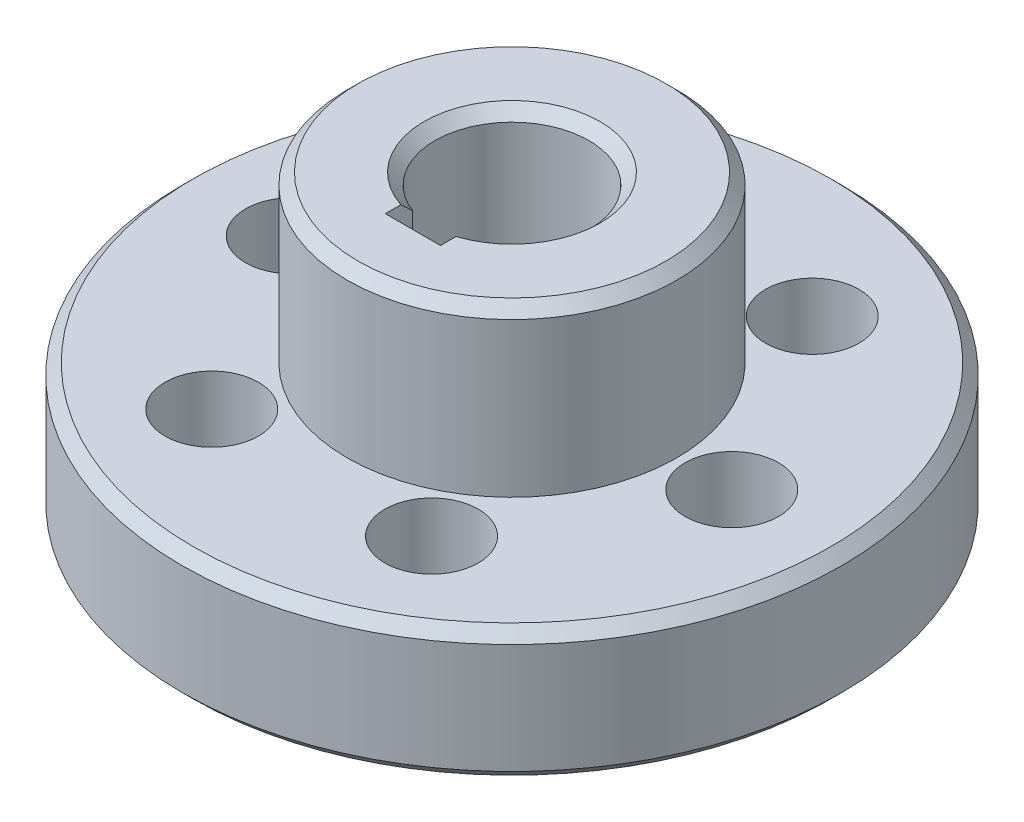
ISO-10303-21;
HEADER;
FILE_DESCRIPTION(('STEP AP214'),'2;1');
FILE_NAME('part.step','',(''),(''),'','','');
FILE_SCHEMA(('AUTOMOTIVE_DESIGN { 1 0 10303 214 1 1 1 1 }'));
ENDSEC;
DATA;
#1=APPLICATION_CONTEXT('core data for automotive mechanical design processes');
#2=APPLICATION_PROTOCOL_DEFINITION('international standard','automotive_design',2000,#1);
#3=PRODUCT_CONTEXT('',#1,'mechanical');
#4=PRODUCT('Part','Part','',(#3));
#5=PRODUCT_RELATED_PRODUCT_CATEGORY('part','',(#4));
#6=PRODUCT_DEFINITION_FORMATION('','',#4);
#7=PRODUCT_DEFINITION_CONTEXT('part definition',#1,'design');
#8=PRODUCT_DEFINITION('design','',#6,#7);
#9=PRODUCT_DEFINITION_SHAPE('','',#8);
#10=(LENGTH_UNIT() NAMED_UNIT(*) SI_UNIT(.MILLI.,.METRE.));
#11=(NAMED_UNIT(*) PLANE_ANGLE_UNIT() SI_UNIT($,.RADIAN.));
#12=(NAMED_UNIT(*) SI_UNIT($,.STERADIAN.) SOLID_ANGLE_UNIT());
#13=UNCERTAINTY_MEASURE_WITH_UNIT(LENGTH_MEASURE(1.E-05),#10,'distance_accuracy_value','');
#14=(GEOMETRIC_REPRESENTATION_CONTEXT(3) GLOBAL_UNCERTAINTY_ASSIGNED_CONTEXT((#13)) GLOBAL_UNIT_ASSIGNED_CONTEXT((#10,
#11,#12)) REPRESENTATION_CONTEXT('',''));
#15=CARTESIAN_POINT('',(0.,0.,0.));
#16=DIRECTION('',(0.,0.,1.));
#17=DIRECTION('',(1.,0.,0.));
#18=AXIS2_PLACEMENT_3D('',#15,#16,#17);
#19=CARTESIAN_POINT('',(10.0000000000002,0.,17.3205080756887));
#20=DIRECTION('',(0.,-1.,0.));
#21=DIRECTION('',(0.,0.,-1.));
#22=AXIS2_PLACEMENT_3D('',#19,#20,#21);
#23=CONICAL_SURFACE('',#22,5.025,0.78539816339745);
#24=CARTESIAN_POINT('',(10.0000000000002,0.775,17.3205080756887));
#25=DIRECTION('',(0.,-1.,0.));
#26=DIRECTION('',(0.,0.,-1.));
#27=AXIS2_PLACEMENT_3D('',#24,#25,#26);
#28=CIRCLE('',#27,4.25);
#29=CARTESIAN_POINT('',(10.0000000000002,0.775,13.0705080756887));
#30=VERTEX_POINT('',#29);
#31=EDGE_CURVE('E11',#30,#30,#28,.T.);
#32=ORIENTED_EDGE('',*,*,#31,.F.);
#33=EDGE_LOOP('',(#32));
#34=FACE_BOUND('',#33,.T.);
#35=CARTESIAN_POINT('',(10.0000000000002,0.,17.3205080756887));
#36=DIRECTION('',(0.,-1.,0.));
#37=DIRECTION('',(0.,0.,-1.));
#38=AXIS2_PLACEMENT_3D('',#35,#36,#37);
#39=CIRCLE('',#38,5.025);
#40=CARTESIAN_POINT('',(10.0000000000002,0.,12.2955080756887));
#41=VERTEX_POINT('',#40);
#42=EDGE_CURVE('E463',#41,#41,#39,.T.);
#43=ORIENTED_EDGE('',*,*,#42,.T.);
#44=EDGE_LOOP('',(#43));
#45=FACE_BOUND('',#44,.T.);
#46=ADVANCED_FACE('F17',(#34,#45),#23,.F.);
#47=CARTESIAN_POINT('',(10.0000000000002,0.,17.3205080756887));
#48=DIRECTION('',(0.,-1.,0.));
#49=DIRECTION('',(0.,0.,-1.));
#50=AXIS2_PLACEMENT_3D('',#47,#48,#49);
#51=CYLINDRICAL_SURFACE('',#50,4.25);
#52=CARTESIAN_POINT('',(10.0000000000002,12.,17.3205080756887));
#53=DIRECTION('',(0.,1.,0.));
#54=DIRECTION('',(0.,0.,1.));
#55=AXIS2_PLACEMENT_3D('',#52,#53,#54);
#56=CIRCLE('',#55,4.25);
#57=CARTESIAN_POINT('',(10.0000000000002,12.,21.5705080756886));
#58=VERTEX_POINT('',#57);
#59=EDGE_CURVE('E185',#58,#58,#56,.T.);
#60=ORIENTED_EDGE('',*,*,#59,.T.);
#61=EDGE_LOOP('',(#60));
#62=FACE_BOUND('',#61,.T.);
#63=ORIENTED_EDGE('',*,*,#31,.T.);
#64=EDGE_LOOP('',(#63));
#65=FACE_BOUND('',#64,.T.);
#66=ADVANCED_FACE('F186',(#62,#65),#51,.F.);
#67=CARTESIAN_POINT('',(-9.99999999999984,0.,17.3205080756888));
#68=DIRECTION('',(0.,-1.,0.));
#69=DIRECTION('',(0.,0.,-1.));
#70=AXIS2_PLACEMENT_3D('',#67,#68,#69);
#71=CONICAL_SURFACE('',#70,5.025,0.785398163397451);
#72=CARTESIAN_POINT('',(-9.99999999999984,0.775,17.3205080756888));
#73=DIRECTION('',(0.,-1.,0.));
#74=DIRECTION('',(0.,0.,-1.));
#75=AXIS2_PLACEMENT_3D('',#72,#73,#74);
#76=CIRCLE('',#75,4.25);
#77=CARTESIAN_POINT('',(-9.99999999999984,0.775,13.0705080756889));
#78=VERTEX_POINT('',#77);
#79=EDGE_CURVE('E25',#78,#78,#76,.T.);
#80=ORIENTED_EDGE('',*,*,#79,.F.);
#81=EDGE_LOOP('',(#80));
#82=FACE_BOUND('',#81,.T.);
#83=CARTESIAN_POINT('',(-9.99999999999984,0.,17.3205080756888));
#84=DIRECTION('',(0.,-1.,0.));
#85=DIRECTION('',(0.,0.,-1.));
#86=AXIS2_PLACEMENT_3D('',#83,#84,#85);
#87=CIRCLE('',#86,5.025);
#88=CARTESIAN_POINT('',(-9.99999999999984,0.,12.2955080756889));
#89=VERTEX_POINT('',#88);
#90=EDGE_CURVE('E469',#89,#89,#87,.T.);
#91=ORIENTED_EDGE('',*,*,#90,.T.);
#92=EDGE_LOOP('',(#91));
#93=FACE_BOUND('',#92,.T.);
#94=ADVANCED_FACE('F589',(#82,#93),#71,.F.);
#95=CARTESIAN_POINT('',(-9.99999999999984,0.,17.3205080756888));
#96=DIRECTION('',(0.,-1.,0.));
#97=DIRECTION('',(0.,0.,-1.));
#98=AXIS2_PLACEMENT_3D('',#95,#96,#97);
#99=CYLINDRICAL_SURFACE('',#98,4.25);
#100=CARTESIAN_POINT('',(-9.99999999999984,12.,17.3205080756888));
#101=DIRECTION('',(0.,1.,0.));
#102=DIRECTION('',(0.,0.,1.));
#103=AXIS2_PLACEMENT_3D('',#100,#101,#102);
#104=CIRCLE('',#103,4.25);
#105=CARTESIAN_POINT('',(-9.99999999999984,12.,21.5705080756888));
#106=VERTEX_POINT('',#105);
#107=EDGE_CURVE('E189',#106,#106,#104,.T.);
#108=ORIENTED_EDGE('',*,*,#107,.T.);
#109=EDGE_LOOP('',(#108));
#110=FACE_BOUND('',#109,.T.);
#111=ORIENTED_EDGE('',*,*,#79,.T.);
#112=EDGE_LOOP('',(#111));
#113=FACE_BOUND('',#112,.T.);
#114=ADVANCED_FACE('F653',(#110,#113),#99,.F.);
#115=CARTESIAN_POINT('',(-20.,0.,0.));
#116=DIRECTION('',(0.,-1.,0.));
#117=DIRECTION('',(0.,0.,-1.));
#118=AXIS2_PLACEMENT_3D('',#115,#116,#117);
#119=CONICAL_SURFACE('',#118,5.025,0.785398163397452);
#120=CARTESIAN_POINT('',(-20.,0.775,0.));
#121=DIRECTION('',(0.,-1.,0.));
#122=DIRECTION('',(0.,0.,-1.));
#123=AXIS2_PLACEMENT_3D('',#120,#121,#122);
#124=CIRCLE('',#123,4.25);
#125=CARTESIAN_POINT('',(-20.,0.775,-4.25));
#126=VERTEX_POINT('',#125);
#127=EDGE_CURVE('E307',#126,#126,#124,.T.);
#128=ORIENTED_EDGE('',*,*,#127,.F.);
#129=EDGE_LOOP('',(#128));
#130=FACE_BOUND('',#129,.T.);
#131=CARTESIAN_POINT('',(-20.,0.,0.));
#132=DIRECTION('',(0.,-1.,0.));
#133=DIRECTION('',(0.,0.,-1.));
#134=AXIS2_PLACEMENT_3D('',#131,#132,#133);
#135=CIRCLE('',#134,5.025);
#136=CARTESIAN_POINT('',(-20.,0.,-5.025));
#137=VERTEX_POINT('',#136);
#138=EDGE_CURVE('E217',#137,#137,#135,.T.);
#139=ORIENTED_EDGE('',*,*,#138,.T.);
#140=EDGE_LOOP('',(#139));
#141=FACE_BOUND('',#140,.T.);
#142=ADVANCED_FACE('F651',(#130,#141),#119,.F.);
#143=CARTESIAN_POINT('',(-20.,0.,0.));
#144=DIRECTION('',(0.,-1.,0.));
#145=DIRECTION('',(0.,0.,-1.));
#146=AXIS2_PLACEMENT_3D('',#143,#144,#145);
#147=CYLINDRICAL_SURFACE('',#146,4.25);
#148=CARTESIAN_POINT('',(-20.,12.,0.));
#149=DIRECTION('',(0.,1.,0.));
#150=DIRECTION('',(0.,0.,1.));
#151=AXIS2_PLACEMENT_3D('',#148,#149,#150);
#152=CIRCLE('',#151,4.25);
#153=CARTESIAN_POINT('',(-20.,12.,4.25));
#154=VERTEX_POINT('',#153);
#155=EDGE_CURVE('E197',#154,#154,#152,.T.);
#156=ORIENTED_EDGE('',*,*,#155,.T.);
#157=EDGE_LOOP('',(#156));
#158=FACE_BOUND('',#157,.T.);
#159=ORIENTED_EDGE('',*,*,#127,.T.);
#160=EDGE_LOOP('',(#159));
#161=FACE_BOUND('',#160,.T.);
#162=ADVANCED_FACE('F644',(#158,#161),#147,.F.);
#163=CARTESIAN_POINT('',(-10.,0.,-17.3205080756888));
#164=DIRECTION('',(0.,-1.,0.));
#165=DIRECTION('',(0.,0.,-1.));
#166=AXIS2_PLACEMENT_3D('',#163,#164,#165);
#167=CONICAL_SURFACE('',#166,5.025,0.785398163397451);
#168=CARTESIAN_POINT('',(-10.,0.775,-17.3205080756888));
#169=DIRECTION('',(0.,-1.,0.));
#170=DIRECTION('',(0.,0.,-1.));
#171=AXIS2_PLACEMENT_3D('',#168,#169,#170);
#172=CIRCLE('',#171,4.25);
#173=CARTESIAN_POINT('',(-10.,0.775,-21.5705080756887));
#174=VERTEX_POINT('',#173);
#175=EDGE_CURVE('E304',#174,#174,#172,.T.);
#176=ORIENTED_EDGE('',*,*,#175,.F.);
#177=EDGE_LOOP('',(#176));
#178=FACE_BOUND('',#177,.T.);
#179=CARTESIAN_POINT('',(-10.,0.,-17.3205080756888));
#180=DIRECTION('',(0.,-1.,0.));
#181=DIRECTION('',(0.,0.,-1.));
#182=AXIS2_PLACEMENT_3D('',#179,#180,#181);
#183=CIRCLE('',#182,5.025);
#184=CARTESIAN_POINT('',(-10.,0.,-22.3455080756888));
#185=VERTEX_POINT('',#184);
#186=EDGE_CURVE('E473',#185,#185,#183,.T.);
#187=ORIENTED_EDGE('',*,*,#186,.T.);
#188=EDGE_LOOP('',(#187));
#189=FACE_BOUND('',#188,.T.);
#190=ADVANCED_FACE('F641',(#178,#189),#167,.F.);
#191=CARTESIAN_POINT('',(-10.,0.,-17.3205080756888));
#192=DIRECTION('',(0.,-1.,0.));
#193=DIRECTION('',(0.,0.,-1.));
#194=AXIS2_PLACEMENT_3D('',#191,#192,#193);
#195=CYLINDRICAL_SURFACE('',#194,4.25);
#196=CARTESIAN_POINT('',(-10.,12.,-17.3205080756888));
#197=DIRECTION('',(0.,1.,0.));
#198=DIRECTION('',(0.,0.,1.));
#199=AXIS2_PLACEMENT_3D('',#196,#197,#198);
#200=CIRCLE('',#199,4.25);
#201=CARTESIAN_POINT('',(-10.,12.,-13.0705080756887));
#202=VERTEX_POINT('',#201);
#203=EDGE_CURVE('E223',#202,#202,#200,.T.);
#204=ORIENTED_EDGE('',*,*,#203,.T.);
#205=EDGE_LOOP('',(#204));
#206=FACE_BOUND('',#205,.T.);
#207=ORIENTED_EDGE('',*,*,#175,.T.);
#208=EDGE_LOOP('',(#207));
#209=FACE_BOUND('',#208,.T.);
#210=ADVANCED_FACE('F639',(#206,#209),#195,.F.);
#211=CARTESIAN_POINT('',(10.,0.,-17.3205080756888));
#212=DIRECTION('',(0.,-1.,0.));
#213=DIRECTION('',(0.,0.,-1.));
#214=AXIS2_PLACEMENT_3D('',#211,#212,#213);
#215=CONICAL_SURFACE('',#214,5.025,0.785398163397452);
#216=CARTESIAN_POINT('',(10.,0.775,-17.3205080756888));
#217=DIRECTION('',(0.,-1.,0.));
#218=DIRECTION('',(0.,0.,-1.));
#219=AXIS2_PLACEMENT_3D('',#216,#217,#218);
#220=CIRCLE('',#219,4.25);
#221=CARTESIAN_POINT('',(10.,0.775,-21.5705080756888));
#222=VERTEX_POINT('',#221);
#223=EDGE_CURVE('E208',#222,#222,#220,.T.);
#224=ORIENTED_EDGE('',*,*,#223,.F.);
#225=EDGE_LOOP('',(#224));
#226=FACE_BOUND('',#225,.T.);
#227=CARTESIAN_POINT('',(10.,0.,-17.3205080756888));
#228=DIRECTION('',(0.,-1.,0.));
#229=DIRECTION('',(0.,0.,-1.));
#230=AXIS2_PLACEMENT_3D('',#227,#228,#229);
#231=CIRCLE('',#230,5.025);
#232=CARTESIAN_POINT('',(10.,0.,-22.3455080756888));
#233=VERTEX_POINT('',#232);
#234=EDGE_CURVE('E487',#233,#233,#231,.T.);
#235=ORIENTED_EDGE('',*,*,#234,.T.);
#236=EDGE_LOOP('',(#235));
#237=FACE_BOUND('',#236,.T.);
#238=ADVANCED_FACE('F635',(#226,#237),#215,.F.);
#239=CARTESIAN_POINT('',(10.,0.,-17.3205080756888));
#240=DIRECTION('',(0.,-1.,0.));
#241=DIRECTION('',(0.,0.,-1.));
#242=AXIS2_PLACEMENT_3D('',#239,#240,#241);
#243=CYLINDRICAL_SURFACE('',#242,4.25);
#244=CARTESIAN_POINT('',(10.,12.,-17.3205080756888));
#245=DIRECTION('',(0.,1.,0.));
#246=DIRECTION('',(0.,0.,1.));
#247=AXIS2_PLACEMENT_3D('',#244,#245,#246);
#248=CIRCLE('',#247,4.25);
#249=CARTESIAN_POINT('',(10.,12.,-13.0705080756888));
#250=VERTEX_POINT('',#249);
#251=EDGE_CURVE('E203',#250,#250,#248,.T.);
#252=ORIENTED_EDGE('',*,*,#251,.T.);
#253=EDGE_LOOP('',(#252));
#254=FACE_BOUND('',#253,.T.);
#255=ORIENTED_EDGE('',*,*,#223,.T.);
#256=EDGE_LOOP('',(#255));
#257=FACE_BOUND('',#256,.T.);
#258=ADVANCED_FACE('F631',(#254,#257),#243,.F.);
#259=CARTESIAN_POINT('',(20.,0.,0.));
#260=DIRECTION('',(0.,-1.,0.));
#261=DIRECTION('',(0.,0.,-1.));
#262=AXIS2_PLACEMENT_3D('',#259,#260,#261);
#263=CONICAL_SURFACE('',#262,5.025,0.785398163397452);
#264=CARTESIAN_POINT('',(20.,0.775,0.));
#265=DIRECTION('',(0.,-1.,0.));
#266=DIRECTION('',(0.,0.,-1.));
#267=AXIS2_PLACEMENT_3D('',#264,#265,#266);
#268=CIRCLE('',#267,4.25);
#269=CARTESIAN_POINT('',(20.,0.775,-4.25));
#270=VERTEX_POINT('',#269);
#271=EDGE_CURVE('E205',#270,#270,#268,.T.);
#272=ORIENTED_EDGE('',*,*,#271,.F.);
#273=EDGE_LOOP('',(#272));
#274=FACE_BOUND('',#273,.T.);
#275=CARTESIAN_POINT('',(20.,0.,0.));
#276=DIRECTION('',(0.,-1.,0.));
#277=DIRECTION('',(0.,0.,-1.));
#278=AXIS2_PLACEMENT_3D('',#275,#276,#277);
#279=CIRCLE('',#278,5.025);
#280=CARTESIAN_POINT('',(20.,0.,-5.025));
#281=VERTEX_POINT('',#280);
#282=EDGE_CURVE('E498',#281,#281,#279,.T.);
#283=ORIENTED_EDGE('',*,*,#282,.T.);
#284=EDGE_LOOP('',(#283));
#285=FACE_BOUND('',#284,.T.);
#286=ADVANCED_FACE('F628',(#274,#285),#263,.F.);
#287=CARTESIAN_POINT('',(20.,0.,0.));
#288=DIRECTION('',(0.,-1.,0.));
#289=DIRECTION('',(0.,0.,-1.));
#290=AXIS2_PLACEMENT_3D('',#287,#288,#289);
#291=CYLINDRICAL_SURFACE('',#290,4.25);
#292=CARTESIAN_POINT('',(20.,12.,0.));
#293=DIRECTION('',(0.,1.,0.));
#294=DIRECTION('',(0.,0.,1.));
#295=AXIS2_PLACEMENT_3D('',#292,#293,#294);
#296=CIRCLE('',#295,4.25);
#297=CARTESIAN_POINT('',(20.,12.,4.25));
#298=VERTEX_POINT('',#297);
#299=EDGE_CURVE('E230',#298,#298,#296,.T.);
#300=ORIENTED_EDGE('',*,*,#299,.T.);
#301=EDGE_LOOP('',(#300));
#302=FACE_BOUND('',#301,.T.);
#303=ORIENTED_EDGE('',*,*,#271,.T.);
#304=EDGE_LOOP('',(#303));
#305=FACE_BOUND('',#304,.T.);
#306=ADVANCED_FACE('F624',(#302,#305),#291,.F.);
#307=CARTESIAN_POINT('',(0.,27.,0.));
#308=DIRECTION('',(0.,1.,0.));
#309=DIRECTION('',(0.,0.,1.));
#310=AXIS2_PLACEMENT_3D('',#307,#308,#309);
#311=CONICAL_SURFACE('',#310,8.01,0.785398163397446);
#312=CARTESIAN_POINT('',(-2.51,26.,6.54522726878143));
#313=CARTESIAN_POINT('',(-2.51,26.3317304089042,6.90051365853141));
#314=CARTESIAN_POINT('',(-2.51,26.6652804969769,7.25410434849121));
#315=CARTESIAN_POINT('',(-2.51,27.,7.60657610229466));
#316=(BOUNDED_CURVE() B_SPLINE_CURVE(3,(#312,#313,#314,#315),.UNSPECIFIED.,.F.,
.F.) B_SPLINE_CURVE_WITH_KNOTS((4,4),(0.,0.00145823912524659),
.UNSPECIFIED.) CURVE() GEOMETRIC_REPRESENTATION_ITEM() RATIONAL_B_SPLINE_CURVE((1.,1.,1.,1.)) REPRESENTATION_ITEM(''));
#317=CARTESIAN_POINT('',(-2.51,26.,6.54522726878143));
#318=VERTEX_POINT('',#317);
#319=CARTESIAN_POINT('',(-2.51,27.,7.60657610229466));
#320=VERTEX_POINT('',#319);
#321=EDGE_CURVE('E209',#318,#320,#316,.T.);
#322=ORIENTED_EDGE('',*,*,#321,.F.);
#323=CARTESIAN_POINT('',(0.,26.,0.));
#324=DIRECTION('',(0.,1.,0.));
#325=DIRECTION('',(0.,0.,1.));
#326=AXIS2_PLACEMENT_3D('',#323,#324,#325);
#327=CIRCLE('',#326,7.01);
#328=CARTESIAN_POINT('',(2.51,26.,6.54522726878143));
#329=VERTEX_POINT('',#328);
#330=EDGE_CURVE('E283',#329,#318,#327,.T.);
#331=ORIENTED_EDGE('',*,*,#330,.F.);
#332=CARTESIAN_POINT('',(2.51,27.,7.60657610229466));
#333=CARTESIAN_POINT('',(2.51,26.6652804969769,7.25410434849121));
#334=CARTESIAN_POINT('',(2.51,26.3317304089042,6.90051365853141));
#335=CARTESIAN_POINT('',(2.51,26.,6.54522726878143));
#336=(BOUNDED_CURVE() B_SPLINE_CURVE(3,(#332,#333,#334,#335),.UNSPECIFIED.,.F.,
.F.) B_SPLINE_CURVE_WITH_KNOTS((4,4),(0.,0.00145823912524659),
.UNSPECIFIED.) CURVE() GEOMETRIC_REPRESENTATION_ITEM() RATIONAL_B_SPLINE_CURVE((1.,1.,1.,1.)) REPRESENTATION_ITEM(''));
#337=CARTESIAN_POINT('',(2.51,27.,7.60657610229466));
#338=VERTEX_POINT('',#337);
#339=EDGE_CURVE('E264',#338,#329,#336,.T.);
#340=ORIENTED_EDGE('',*,*,#339,.F.);
#341=CARTESIAN_POINT('',(0.,27.,0.));
#342=DIRECTION('',(0.,-1.,0.));
#343=DIRECTION('',(0.,0.,1.));
#344=AXIS2_PLACEMENT_3D('',#341,#342,#343);
#345=CIRCLE('',#344,8.01);
#346=EDGE_CURVE('E240',#320,#338,#345,.T.);
#347=ORIENTED_EDGE('',*,*,#346,.F.);
#348=EDGE_LOOP('',(#322,#331,#340,#347));
#349=FACE_BOUND('',#348,.T.);
#350=ADVANCED_FACE('F561',(#349),#311,.F.);
#351=CARTESIAN_POINT('',(0.,27.,0.));
#352=DIRECTION('',(0.,-1.,0.));
#353=DIRECTION('',(0.,0.,-1.));
#354=AXIS2_PLACEMENT_3D('',#351,#352,#353);
#355=CONICAL_SURFACE('',#354,14.,0.785398163397443);
#356=CARTESIAN_POINT('',(0.,27.,0.));
#357=DIRECTION('',(0.,1.,0.));
#358=DIRECTION('',(0.,0.,1.));
#359=AXIS2_PLACEMENT_3D('',#356,#357,#358);
#360=CIRCLE('',#359,14.);
#361=CARTESIAN_POINT('',(0.,27.,14.));
#362=VERTEX_POINT('',#361);
#363=EDGE_CURVE('E233',#362,#362,#360,.T.);
#364=ORIENTED_EDGE('',*,*,#363,.F.);
#365=EDGE_LOOP('',(#364));
#366=FACE_BOUND('',#365,.T.);
#367=CARTESIAN_POINT('',(0.,26.,0.));
#368=DIRECTION('',(0.,-1.,0.));
#369=DIRECTION('',(0.,0.,1.));
#370=AXIS2_PLACEMENT_3D('',#367,#368,#369);
#371=CIRCLE('',#370,15.);
#372=CARTESIAN_POINT('',(0.,26.,15.));
#373=VERTEX_POINT('',#372);
#374=EDGE_CURVE('E229',#373,#373,#371,.T.);
#375=ORIENTED_EDGE('',*,*,#374,.F.);
#376=EDGE_LOOP('',(#375));
#377=FACE_BOUND('',#376,.T.);
#378=ADVANCED_FACE('F614',(#366,#377),#355,.T.);
#379=CARTESIAN_POINT('',(0.,12.,0.));
#380=DIRECTION('',(0.,-1.,0.));
#381=DIRECTION('',(0.,0.,-1.));
#382=AXIS2_PLACEMENT_3D('',#379,#380,#381);
#383=CONICAL_SURFACE('',#382,29.,0.785398163397446);
#384=CARTESIAN_POINT('',(0.,12.,0.));
#385=DIRECTION('',(0.,1.,0.));
#386=DIRECTION('',(0.,0.,1.));
#387=AXIS2_PLACEMENT_3D('',#384,#385,#386);
#388=CIRCLE('',#387,29.);
#389=CARTESIAN_POINT('',(0.,12.,29.));
#390=VERTEX_POINT('',#389);
#391=EDGE_CURVE('E190',#390,#390,#388,.T.);
#392=ORIENTED_EDGE('',*,*,#391,.F.);
#393=EDGE_LOOP('',(#392));
#394=FACE_BOUND('',#393,.T.);
#395=CARTESIAN_POINT('',(0.,11.,0.));
#396=DIRECTION('',(0.,-1.,0.));
#397=DIRECTION('',(0.,0.,1.));
#398=AXIS2_PLACEMENT_3D('',#395,#396,#397);
#399=CIRCLE('',#398,30.);
#400=CARTESIAN_POINT('',(0.,11.,30.));
#401=VERTEX_POINT('',#400);
#402=EDGE_CURVE('E212',#401,#401,#399,.T.);
#403=ORIENTED_EDGE('',*,*,#402,.F.);
#404=EDGE_LOOP('',(#403));
#405=FACE_BOUND('',#404,.T.);
#406=ADVANCED_FACE('F603',(#394,#405),#383,.T.);
#407=CARTESIAN_POINT('',(0.,1.,0.));
#408=DIRECTION('',(0.,1.,0.));
#409=DIRECTION('',(0.,0.,1.));
#410=AXIS2_PLACEMENT_3D('',#407,#408,#409);
#411=CONICAL_SURFACE('',#410,30.,0.785398163397455);
#412=CARTESIAN_POINT('',(0.,0.,0.));
#413=DIRECTION('',(0.,-1.,0.));
#414=DIRECTION('',(0.,0.,1.));
#415=AXIS2_PLACEMENT_3D('',#412,#413,#414);
#416=CIRCLE('',#415,29.);
#417=CARTESIAN_POINT('',(0.,0.,29.));
#418=VERTEX_POINT('',#417);
#419=EDGE_CURVE('E459',#418,#418,#416,.T.);
#420=ORIENTED_EDGE('',*,*,#419,.F.);
#421=EDGE_LOOP('',(#420));
#422=FACE_BOUND('',#421,.T.);
#423=CARTESIAN_POINT('',(0.,1.,0.));
#424=DIRECTION('',(0.,1.,0.));
#425=DIRECTION('',(0.,0.,1.));
#426=AXIS2_PLACEMENT_3D('',#423,#424,#425);
#427=CIRCLE('',#426,30.);
#428=CARTESIAN_POINT('',(0.,1.,30.));
#429=VERTEX_POINT('',#428);
#430=EDGE_CURVE('E199',#429,#429,#427,.T.);
#431=ORIENTED_EDGE('',*,*,#430,.F.);
#432=EDGE_LOOP('',(#431));
#433=FACE_BOUND('',#432,.T.);
#434=ADVANCED_FACE('F600',(#422,#433),#411,.T.);
#435=CARTESIAN_POINT('',(0.,1.,0.));
#436=DIRECTION('',(0.,-1.,0.));
#437=DIRECTION('',(0.,0.,-1.));
#438=AXIS2_PLACEMENT_3D('',#435,#436,#437);
#439=CONICAL_SURFACE('',#438,7.01,0.785398163397456);
#440=CARTESIAN_POINT('',(-2.51,0.,7.60657610229466));
#441=CARTESIAN_POINT('',(-2.51,0.334719503023117,7.25410434849121));
#442=CARTESIAN_POINT('',(-2.51,0.668269591095801,6.90051365853141));
#443=CARTESIAN_POINT('',(-2.51,1.,6.54522726878143));
#444=(BOUNDED_CURVE() B_SPLINE_CURVE(3,(#440,#441,#442,#443),.UNSPECIFIED.,.F.,
.F.) B_SPLINE_CURVE_WITH_KNOTS((4,4),(0.,0.00145823912524658),
.UNSPECIFIED.) CURVE() GEOMETRIC_REPRESENTATION_ITEM() RATIONAL_B_SPLINE_CURVE((1.,1.,1.,1.)) REPRESENTATION_ITEM(''));
#445=CARTESIAN_POINT('',(-2.51,0.,7.60657610229466));
#446=VERTEX_POINT('',#445);
#447=CARTESIAN_POINT('',(-2.51,1.,6.54522726878143));
#448=VERTEX_POINT('',#447);
#449=EDGE_CURVE('E287',#446,#448,#444,.T.);
#450=ORIENTED_EDGE('',*,*,#449,.F.);
#451=CARTESIAN_POINT('',(0.,0.,0.));
#452=DIRECTION('',(0.,1.,0.));
#453=DIRECTION('',(0.,0.,1.));
#454=AXIS2_PLACEMENT_3D('',#451,#452,#453);
#455=CIRCLE('',#454,8.01);
#456=CARTESIAN_POINT('',(2.51,0.,7.60657610229466));
#457=VERTEX_POINT('',#456);
#458=EDGE_CURVE('E497',#457,#446,#455,.T.);
#459=ORIENTED_EDGE('',*,*,#458,.F.);
#460=CARTESIAN_POINT('',(2.51,1.,6.54522726878143));
#461=CARTESIAN_POINT('',(2.51,0.668269591095801,6.90051365853141));
#462=CARTESIAN_POINT('',(2.51,0.334719503023116,7.25410434849121));
#463=CARTESIAN_POINT('',(2.51,0.,7.60657610229466));
#464=(BOUNDED_CURVE() B_SPLINE_CURVE(3,(#460,#461,#462,#463),.UNSPECIFIED.,.F.,
.F.) B_SPLINE_CURVE_WITH_KNOTS((4,4),(0.,0.00145823912524658),
.UNSPECIFIED.) CURVE() GEOMETRIC_REPRESENTATION_ITEM() RATIONAL_B_SPLINE_CURVE((1.,1.,1.,1.)) REPRESENTATION_ITEM(''));
#465=CARTESIAN_POINT('',(2.51,1.,6.54522726878143));
#466=VERTEX_POINT('',#465);
#467=EDGE_CURVE('E259',#466,#457,#464,.T.);
#468=ORIENTED_EDGE('',*,*,#467,.F.);
#469=CARTESIAN_POINT('',(0.,1.,0.));
#470=DIRECTION('',(0.,-1.,0.));
#471=DIRECTION('',(0.,0.,1.));
#472=AXIS2_PLACEMENT_3D('',#469,#470,#471);
#473=CIRCLE('',#472,7.01);
#474=EDGE_CURVE('E280',#448,#466,#473,.T.);
#475=ORIENTED_EDGE('',*,*,#474,.F.);
#476=EDGE_LOOP('',(#450,#459,#468,#475));
#477=FACE_BOUND('',#476,.T.);
#478=ADVANCED_FACE('F555',(#477),#439,.F.);
#479=CARTESIAN_POINT('',(-2.51,27.,9.02));
#480=DIRECTION('',(-1.,0.,0.));
#481=DIRECTION('',(0.,0.,1.));
#482=AXIS2_PLACEMENT_3D('',#479,#480,#481);
#483=PLANE('',#482);
#484=DIRECTION('',(0.,0.,-1.));
#485=VECTOR('',#484,1.);
#486=CARTESIAN_POINT('',(-2.51,0.,9.02));
#487=LINE('',#486,#485);
#488=CARTESIAN_POINT('',(-2.51,0.,9.02));
#489=VERTEX_POINT('',#488);
#490=EDGE_CURVE('E218',#489,#446,#487,.T.);
#491=ORIENTED_EDGE('',*,*,#490,.T.);
#492=ORIENTED_EDGE('',*,*,#449,.T.);
#493=DIRECTION('',(0.,-1.,0.));
#494=VECTOR('',#493,1.);
#495=CARTESIAN_POINT('',(-2.51,27.,6.54522726878143));
#496=LINE('',#495,#494);
#497=EDGE_CURVE('E273',#318,#448,#496,.T.);
#498=ORIENTED_EDGE('',*,*,#497,.F.);
#499=ORIENTED_EDGE('',*,*,#321,.T.);
#500=DIRECTION('',(0.,0.,-1.));
#501=VECTOR('',#500,1.);
#502=CARTESIAN_POINT('',(-2.51,27.,9.02));
#503=LINE('',#502,#501);
#504=CARTESIAN_POINT('',(-2.51,27.,9.02));
#505=VERTEX_POINT('',#504);
#506=EDGE_CURVE('E236',#505,#320,#503,.T.);
#507=ORIENTED_EDGE('',*,*,#506,.F.);
#508=DIRECTION('',(0.,-1.,0.));
#509=VECTOR('',#508,1.);
#510=CARTESIAN_POINT('',(-2.51,27.,9.02));
#511=LINE('',#510,#509);
#512=EDGE_CURVE('E252',#505,#489,#511,.T.);
#513=ORIENTED_EDGE('',*,*,#512,.T.);
#514=EDGE_LOOP('',(#491,#492,#498,#499,#507,#513));
#515=FACE_BOUND('',#514,.T.);
#516=ADVANCED_FACE('F543',(#515),#483,.F.);
#517=CARTESIAN_POINT('',(0.,27.,0.));
#518=DIRECTION('',(0.,-1.,0.));
#519=DIRECTION('',(0.,0.,-1.));
#520=AXIS2_PLACEMENT_3D('',#517,#518,#519);
#521=CYLINDRICAL_SURFACE('',#520,7.01);
#522=ORIENTED_EDGE('',*,*,#497,.T.);
#523=ORIENTED_EDGE('',*,*,#474,.T.);
#524=DIRECTION('',(0.,-1.,0.));
#525=VECTOR('',#524,1.);
#526=CARTESIAN_POINT('',(2.51,27.,6.54522726878143));
#527=LINE('',#526,#525);
#528=EDGE_CURVE('E258',#329,#466,#527,.T.);
#529=ORIENTED_EDGE('',*,*,#528,.F.);
#530=ORIENTED_EDGE('',*,*,#330,.T.);
#531=EDGE_LOOP('',(#522,#523,#529,#530));
#532=FACE_BOUND('',#531,.T.);
#533=ADVANCED_FACE('F558',(#532),#521,.F.);
#534=CARTESIAN_POINT('',(2.51,27.,9.02));
#535=DIRECTION('',(1.,0.,0.));
#536=DIRECTION('',(0.,1.,0.));
#537=AXIS2_PLACEMENT_3D('',#534,#535,#536);
#538=PLANE('',#537);
#539=ORIENTED_EDGE('',*,*,#528,.T.);
#540=ORIENTED_EDGE('',*,*,#467,.T.);
#541=DIRECTION('',(0.,0.,1.));
#542=VECTOR('',#541,1.);
#543=CARTESIAN_POINT('',(2.51,0.,9.02));
#544=LINE('',#543,#542);
#545=CARTESIAN_POINT('',(2.51,0.,9.02));
#546=VERTEX_POINT('',#545);
#547=EDGE_CURVE('E493',#457,#546,#544,.T.);
#548=ORIENTED_EDGE('',*,*,#547,.T.);
#549=DIRECTION('',(0.,-1.,0.));
#550=VECTOR('',#549,1.);
#551=CARTESIAN_POINT('',(2.51,27.,9.02));
#552=LINE('',#551,#550);
#553=CARTESIAN_POINT('',(2.51,27.,9.02));
#554=VERTEX_POINT('',#553);
#555=EDGE_CURVE('E255',#554,#546,#552,.T.);
#556=ORIENTED_EDGE('',*,*,#555,.F.);
#557=DIRECTION('',(0.,0.,1.));
#558=VECTOR('',#557,1.);
#559=CARTESIAN_POINT('',(2.51,27.,9.02));
#560=LINE('',#559,#558);
#561=EDGE_CURVE('E244',#338,#554,#560,.T.);
#562=ORIENTED_EDGE('',*,*,#561,.F.);
#563=ORIENTED_EDGE('',*,*,#339,.T.);
#564=EDGE_LOOP('',(#539,#540,#548,#556,#562,#563));
#565=FACE_BOUND('',#564,.T.);
#566=ADVANCED_FACE('F570',(#565),#538,.F.);
#567=CARTESIAN_POINT('',(2.51,27.,9.02));
#568=DIRECTION('',(0.,0.,1.));
#569=DIRECTION('',(1.,0.,0.));
#570=AXIS2_PLACEMENT_3D('',#567,#568,#569);
#571=PLANE('',#570);
#572=DIRECTION('',(-1.,0.,0.));
#573=VECTOR('',#572,1.);
#574=CARTESIAN_POINT('',(2.51,0.,9.02));
#575=LINE('',#574,#573);
#576=EDGE_CURVE('E213',#546,#489,#575,.T.);
#577=ORIENTED_EDGE('',*,*,#576,.T.);
#578=ORIENTED_EDGE('',*,*,#512,.F.);
#579=DIRECTION('',(-1.,0.,0.));
#580=VECTOR('',#579,1.);
#581=CARTESIAN_POINT('',(2.51,27.,9.02));
#582=LINE('',#581,#580);
#583=EDGE_CURVE('E248',#554,#505,#582,.T.);
#584=ORIENTED_EDGE('',*,*,#583,.F.);
#585=ORIENTED_EDGE('',*,*,#555,.T.);
#586=EDGE_LOOP('',(#577,#578,#584,#585));
#587=FACE_BOUND('',#586,.T.);
#588=ADVANCED_FACE('F568',(#587),#571,.F.);
#589=CARTESIAN_POINT('',(0.,27.,0.));
#590=DIRECTION('',(0.,1.,0.));
#591=DIRECTION('',(1.,0.,0.));
#592=AXIS2_PLACEMENT_3D('',#589,#590,#591);
#593=PLANE('',#592);
#594=ORIENTED_EDGE('',*,*,#506,.T.);
#595=ORIENTED_EDGE('',*,*,#346,.T.);
#596=ORIENTED_EDGE('',*,*,#561,.T.);
#597=ORIENTED_EDGE('',*,*,#583,.T.);
#598=EDGE_LOOP('',(#594,#595,#596,#597));
#599=FACE_BOUND('',#598,.T.);
#600=ORIENTED_EDGE('',*,*,#363,.T.);
#601=EDGE_LOOP('',(#600));
#602=FACE_BOUND('',#601,.T.);
#603=ADVANCED_FACE('F564',(#599,#602),#593,.T.);
#604=CARTESIAN_POINT('',(0.,27.,0.));
#605=DIRECTION('',(0.,-1.,0.));
#606=DIRECTION('',(0.,0.,-1.));
#607=AXIS2_PLACEMENT_3D('',#604,#605,#606);
#608=CYLINDRICAL_SURFACE('',#607,15.);
#609=ORIENTED_EDGE('',*,*,#374,.T.);
#610=EDGE_LOOP('',(#609));
#611=FACE_BOUND('',#610,.T.);
#612=CARTESIAN_POINT('',(0.,12.,0.));
#613=DIRECTION('',(0.,1.,0.));
#614=DIRECTION('',(0.,0.,1.));
#615=AXIS2_PLACEMENT_3D('',#612,#613,#614);
#616=CIRCLE('',#615,15.);
#617=CARTESIAN_POINT('',(0.,12.,15.));
#618=VERTEX_POINT('',#617);
#619=EDGE_CURVE('E226',#618,#618,#616,.T.);
#620=ORIENTED_EDGE('',*,*,#619,.T.);
#621=EDGE_LOOP('',(#620));
#622=FACE_BOUND('',#621,.T.);
#623=ADVANCED_FACE('F800',(#611,#622),#608,.T.);
#624=CARTESIAN_POINT('',(0.,12.,0.));
#625=DIRECTION('',(0.,1.,0.));
#626=DIRECTION('',(1.,0.,0.));
#627=AXIS2_PLACEMENT_3D('',#624,#625,#626);
#628=PLANE('',#627);
#629=ORIENTED_EDGE('',*,*,#619,.F.);
#630=EDGE_LOOP('',(#629));
#631=FACE_BOUND('',#630,.T.);
#632=ORIENTED_EDGE('',*,*,#299,.F.);
#633=EDGE_LOOP('',(#632));
#634=FACE_BOUND('',#633,.T.);
#635=ORIENTED_EDGE('',*,*,#251,.F.);
#636=EDGE_LOOP('',(#635));
#637=FACE_BOUND('',#636,.T.);
#638=ORIENTED_EDGE('',*,*,#203,.F.);
#639=EDGE_LOOP('',(#638));
#640=FACE_BOUND('',#639,.T.);
#641=ORIENTED_EDGE('',*,*,#155,.F.);
#642=EDGE_LOOP('',(#641));
#643=FACE_BOUND('',#642,.T.);
#644=ORIENTED_EDGE('',*,*,#107,.F.);
#645=EDGE_LOOP('',(#644));
#646=FACE_BOUND('',#645,.T.);
#647=ORIENTED_EDGE('',*,*,#59,.F.);
#648=EDGE_LOOP('',(#647));
#649=FACE_BOUND('',#648,.T.);
#650=ORIENTED_EDGE('',*,*,#391,.T.);
#651=EDGE_LOOP('',(#650));
#652=FACE_BOUND('',#651,.T.);
#653=ADVANCED_FACE('F609',(#631,#634,#637,#640,#643,#646,#649,#652),#628,.T.);
#654=CARTESIAN_POINT('',(0.,12.,0.));
#655=DIRECTION('',(0.,-1.,0.));
#656=DIRECTION('',(0.,0.,-1.));
#657=AXIS2_PLACEMENT_3D('',#654,#655,#656);
#658=CYLINDRICAL_SURFACE('',#657,30.);
#659=ORIENTED_EDGE('',*,*,#430,.T.);
#660=EDGE_LOOP('',(#659));
#661=FACE_BOUND('',#660,.T.);
#662=ORIENTED_EDGE('',*,*,#402,.T.);
#663=EDGE_LOOP('',(#662));
#664=FACE_BOUND('',#663,.T.);
#665=ADVANCED_FACE('F595',(#661,#664),#658,.T.);
#666=CARTESIAN_POINT('',(0.,0.,0.));
#667=DIRECTION('',(0.,1.,0.));
#668=DIRECTION('',(1.,0.,0.));
#669=AXIS2_PLACEMENT_3D('',#666,#667,#668);
#670=PLANE('',#669);
#671=ORIENTED_EDGE('',*,*,#138,.F.);
#672=EDGE_LOOP('',(#671));
#673=FACE_BOUND('',#672,.T.);
#674=ORIENTED_EDGE('',*,*,#547,.F.);
#675=ORIENTED_EDGE('',*,*,#458,.T.);
#676=ORIENTED_EDGE('',*,*,#490,.F.);
#677=ORIENTED_EDGE('',*,*,#576,.F.);
#678=EDGE_LOOP('',(#674,#675,#676,#677));
#679=FACE_BOUND('',#678,.T.);
#680=ORIENTED_EDGE('',*,*,#282,.F.);
#681=EDGE_LOOP('',(#680));
#682=FACE_BOUND('',#681,.T.);
#683=ORIENTED_EDGE('',*,*,#234,.F.);
#684=EDGE_LOOP('',(#683));
#685=FACE_BOUND('',#684,.T.);
#686=ORIENTED_EDGE('',*,*,#186,.F.);
#687=EDGE_LOOP('',(#686));
#688=FACE_BOUND('',#687,.T.);
#689=ORIENTED_EDGE('',*,*,#90,.F.);
#690=EDGE_LOOP('',(#689));
#691=FACE_BOUND('',#690,.T.);
#692=ORIENTED_EDGE('',*,*,#42,.F.);
#693=EDGE_LOOP('',(#692));
#694=FACE_BOUND('',#693,.T.);
#695=ORIENTED_EDGE('',*,*,#419,.T.);
#696=EDGE_LOOP('',(#695));
#697=FACE_BOUND('',#696,.T.);
#698=ADVANCED_FACE('F551',(#673,#679,#682,#685,#688,#691,#694,#697),#670,.F.);
#699=CLOSED_SHELL('',(#46,#66,#94,#114,#142,#162,#190,#210,#238,#258,#286,#306,#350,#378,#406,
#434,#478,#516,#533,#566,#588,#603,#623,#653,#665,#698));
#700=MANIFOLD_SOLID_BREP('B1',#699);
#701=ADVANCED_BREP_SHAPE_REPRESENTATION('',(#18,#700),#14);
#702=SHAPE_DEFINITION_REPRESENTATION(#9,#701);
ENDSEC;
END-ISO-10303-21;
